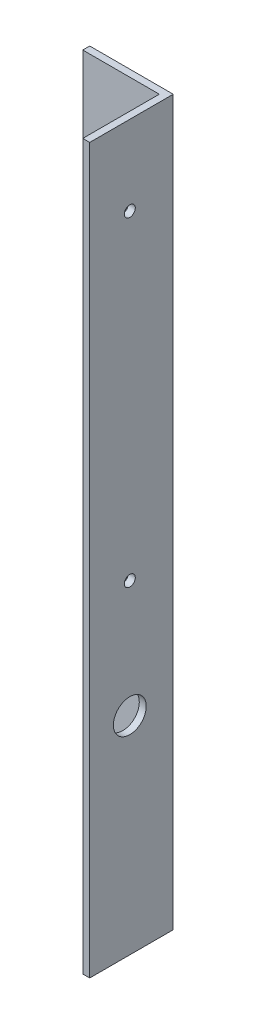
ISO-10303-21;
HEADER;
FILE_DESCRIPTION(('STEP AP214'),'2;1');
FILE_NAME('part.step','',(''),(''),'','','');
FILE_SCHEMA(('AUTOMOTIVE_DESIGN { 1 0 10303 214 1 1 1 1 }'));
ENDSEC;
DATA;
#1=APPLICATION_CONTEXT('core data for automotive mechanical design processes');
#2=APPLICATION_PROTOCOL_DEFINITION('international standard','automotive_design',2000,#1);
#3=PRODUCT_CONTEXT('',#1,'mechanical');
#4=PRODUCT('Part','Part','',(#3));
#5=PRODUCT_RELATED_PRODUCT_CATEGORY('part','',(#4));
#6=PRODUCT_DEFINITION_FORMATION('','',#4);
#7=PRODUCT_DEFINITION_CONTEXT('part definition',#1,'design');
#8=PRODUCT_DEFINITION('design','',#6,#7);
#9=PRODUCT_DEFINITION_SHAPE('','',#8);
#10=(LENGTH_UNIT() NAMED_UNIT(*) SI_UNIT(.MILLI.,.METRE.));
#11=(NAMED_UNIT(*) PLANE_ANGLE_UNIT() SI_UNIT($,.RADIAN.));
#12=(NAMED_UNIT(*) SI_UNIT($,.STERADIAN.) SOLID_ANGLE_UNIT());
#13=UNCERTAINTY_MEASURE_WITH_UNIT(LENGTH_MEASURE(1.E-05),#10,'distance_accuracy_value','');
#14=(GEOMETRIC_REPRESENTATION_CONTEXT(3) GLOBAL_UNCERTAINTY_ASSIGNED_CONTEXT((#13)) GLOBAL_UNIT_ASSIGNED_CONTEXT((#10,
#11,#12)) REPRESENTATION_CONTEXT('',''));
#15=CARTESIAN_POINT('',(0.,0.,0.));
#16=DIRECTION('',(0.,0.,1.));
#17=DIRECTION('',(1.,0.,0.));
#18=AXIS2_PLACEMENT_3D('',#15,#16,#17);
#19=CARTESIAN_POINT('',(15.875,165.1,19.05));
#20=DIRECTION('',(0.,0.,-1.));
#21=DIRECTION('',(-1.,0.,0.));
#22=AXIS2_PLACEMENT_3D('',#19,#20,#21);
#23=PLANE('',#22);
#24=DIRECTION('',(1.,0.,0.));
#25=VECTOR('',#24,1.);
#26=CARTESIAN_POINT('',(15.875,-165.1,19.05));
#27=LINE('',#26,#25);
#28=CARTESIAN_POINT('',(15.875,-165.1,19.05));
#29=VERTEX_POINT('',#28);
#30=CARTESIAN_POINT('',(19.05,-165.1,19.05));
#31=VERTEX_POINT('',#30);
#32=EDGE_CURVE('E118',#29,#31,#27,.T.);
#33=ORIENTED_EDGE('',*,*,#32,.T.);
#34=DIRECTION('',(0.,-1.,0.));
#35=VECTOR('',#34,1.);
#36=CARTESIAN_POINT('',(19.05,165.1,19.05));
#37=LINE('',#36,#35);
#38=CARTESIAN_POINT('',(19.05,165.1,19.05));
#39=VERTEX_POINT('',#38);
#40=EDGE_CURVE('E11',#39,#31,#37,.T.);
#41=ORIENTED_EDGE('',*,*,#40,.F.);
#42=DIRECTION('',(1.,0.,0.));
#43=VECTOR('',#42,1.);
#44=CARTESIAN_POINT('',(15.875,165.1,19.05));
#45=LINE('',#44,#43);
#46=CARTESIAN_POINT('',(15.875,165.1,19.05));
#47=VERTEX_POINT('',#46);
#48=EDGE_CURVE('E129',#47,#39,#45,.T.);
#49=ORIENTED_EDGE('',*,*,#48,.F.);
#50=DIRECTION('',(0.,-1.,0.));
#51=VECTOR('',#50,1.);
#52=CARTESIAN_POINT('',(15.875,165.1,19.05));
#53=LINE('',#52,#51);
#54=EDGE_CURVE('E114',#47,#29,#53,.T.);
#55=ORIENTED_EDGE('',*,*,#54,.T.);
#56=EDGE_LOOP('',(#33,#41,#49,#55));
#57=FACE_BOUND('',#56,.T.);
#58=ADVANCED_FACE('F32',(#57),#23,.F.);
#59=CARTESIAN_POINT('',(19.05,165.1,-19.05));
#60=DIRECTION('',(-1.,0.,0.));
#61=DIRECTION('',(0.,0.,1.));
#62=AXIS2_PLACEMENT_3D('',#59,#60,#61);
#63=PLANE('',#62);
#64=CARTESIAN_POINT('',(19.05,-70.5739,0.762000000000023));
#65=DIRECTION('',(-1.,0.,0.));
#66=DIRECTION('',(0.,0.,1.));
#67=AXIS2_PLACEMENT_3D('',#64,#65,#66);
#68=CIRCLE('',#67,7.50000000000001);
#69=CARTESIAN_POINT('',(19.05,-70.5739,8.26200000000003));
#70=VERTEX_POINT('',#69);
#71=EDGE_CURVE('E122',#70,#70,#68,.T.);
#72=ORIENTED_EDGE('',*,*,#71,.T.);
#73=EDGE_LOOP('',(#72));
#74=FACE_BOUND('',#73,.T.);
#75=CARTESIAN_POINT('',(19.05,128.8161,0.762000000000002));
#76=DIRECTION('',(-1.,0.,0.));
#77=DIRECTION('',(0.,0.,1.));
#78=AXIS2_PLACEMENT_3D('',#75,#76,#77);
#79=CIRCLE('',#78,2.49999999999992);
#80=CARTESIAN_POINT('',(19.05,128.8161,3.26199999999993));
#81=VERTEX_POINT('',#80);
#82=EDGE_CURVE('E140',#81,#81,#79,.T.);
#83=ORIENTED_EDGE('',*,*,#82,.T.);
#84=EDGE_LOOP('',(#83));
#85=FACE_BOUND('',#84,.T.);
#86=CARTESIAN_POINT('',(19.05,-17.2339,0.762000000000009));
#87=DIRECTION('',(-1.,0.,0.));
#88=DIRECTION('',(0.,0.,1.));
#89=AXIS2_PLACEMENT_3D('',#86,#87,#88);
#90=CIRCLE('',#89,2.49999999999995);
#91=CARTESIAN_POINT('',(19.05,-17.2339,3.26199999999996));
#92=VERTEX_POINT('',#91);
#93=EDGE_CURVE('E137',#92,#92,#90,.T.);
#94=ORIENTED_EDGE('',*,*,#93,.T.);
#95=EDGE_LOOP('',(#94));
#96=FACE_BOUND('',#95,.T.);
#97=DIRECTION('',(0.,0.,-1.));
#98=VECTOR('',#97,1.);
#99=CARTESIAN_POINT('',(19.05,-165.1,-19.05));
#100=LINE('',#99,#98);
#101=CARTESIAN_POINT('',(19.05,-165.1,-19.05));
#102=VERTEX_POINT('',#101);
#103=EDGE_CURVE('E121',#31,#102,#100,.T.);
#104=ORIENTED_EDGE('',*,*,#103,.T.);
#105=DIRECTION('',(0.,-1.,0.));
#106=VECTOR('',#105,1.);
#107=CARTESIAN_POINT('',(19.05,165.1,-19.05));
#108=LINE('',#107,#106);
#109=CARTESIAN_POINT('',(19.05,165.1,-19.05));
#110=VERTEX_POINT('',#109);
#111=EDGE_CURVE('E41',#110,#102,#108,.T.);
#112=ORIENTED_EDGE('',*,*,#111,.F.);
#113=DIRECTION('',(0.,0.,-1.));
#114=VECTOR('',#113,1.);
#115=CARTESIAN_POINT('',(19.05,165.1,-19.05));
#116=LINE('',#115,#114);
#117=EDGE_CURVE('E87',#39,#110,#116,.T.);
#118=ORIENTED_EDGE('',*,*,#117,.F.);
#119=ORIENTED_EDGE('',*,*,#40,.T.);
#120=EDGE_LOOP('',(#104,#112,#118,#119));
#121=FACE_BOUND('',#120,.T.);
#122=ADVANCED_FACE('F155',(#74,#85,#96,#121),#63,.F.);
#123=CARTESIAN_POINT('',(-19.05,165.1,-19.05));
#124=DIRECTION('',(0.,0.,1.));
#125=DIRECTION('',(1.,0.,0.));
#126=AXIS2_PLACEMENT_3D('',#123,#124,#125);
#127=PLANE('',#126);
#128=DIRECTION('',(-1.,0.,0.));
#129=VECTOR('',#128,1.);
#130=CARTESIAN_POINT('',(-19.05,-165.1,-19.05));
#131=LINE('',#130,#129);
#132=CARTESIAN_POINT('',(-19.05,-165.1,-19.05));
#133=VERTEX_POINT('',#132);
#134=EDGE_CURVE('E124',#102,#133,#131,.T.);
#135=ORIENTED_EDGE('',*,*,#134,.T.);
#136=DIRECTION('',(0.,-1.,0.));
#137=VECTOR('',#136,1.);
#138=CARTESIAN_POINT('',(-19.05,165.1,-19.05));
#139=LINE('',#138,#137);
#140=CARTESIAN_POINT('',(-19.05,165.1,-19.05));
#141=VERTEX_POINT('',#140);
#142=EDGE_CURVE('E109',#141,#133,#139,.T.);
#143=ORIENTED_EDGE('',*,*,#142,.F.);
#144=DIRECTION('',(-1.,0.,0.));
#145=VECTOR('',#144,1.);
#146=CARTESIAN_POINT('',(-19.05,165.1,-19.05));
#147=LINE('',#146,#145);
#148=EDGE_CURVE('E100',#110,#141,#147,.T.);
#149=ORIENTED_EDGE('',*,*,#148,.F.);
#150=ORIENTED_EDGE('',*,*,#111,.T.);
#151=EDGE_LOOP('',(#135,#143,#149,#150));
#152=FACE_BOUND('',#151,.T.);
#153=ADVANCED_FACE('F158',(#152),#127,.F.);
#154=CARTESIAN_POINT('',(-19.05,165.1,-15.875));
#155=DIRECTION('',(1.,0.,0.));
#156=DIRECTION('',(0.,0.,-1.));
#157=AXIS2_PLACEMENT_3D('',#154,#155,#156);
#158=PLANE('',#157);
#159=DIRECTION('',(0.,0.,1.));
#160=VECTOR('',#159,1.);
#161=CARTESIAN_POINT('',(-19.05,-165.1,-15.875));
#162=LINE('',#161,#160);
#163=CARTESIAN_POINT('',(-19.05,-165.1,-15.875));
#164=VERTEX_POINT('',#163);
#165=EDGE_CURVE('E108',#133,#164,#162,.T.);
#166=ORIENTED_EDGE('',*,*,#165,.T.);
#167=DIRECTION('',(0.,-1.,0.));
#168=VECTOR('',#167,1.);
#169=CARTESIAN_POINT('',(-19.05,165.1,-15.875));
#170=LINE('',#169,#168);
#171=CARTESIAN_POINT('',(-19.05,165.1,-15.875));
#172=VERTEX_POINT('',#171);
#173=EDGE_CURVE('E105',#172,#164,#170,.T.);
#174=ORIENTED_EDGE('',*,*,#173,.F.);
#175=DIRECTION('',(0.,0.,1.));
#176=VECTOR('',#175,1.);
#177=CARTESIAN_POINT('',(-19.05,165.1,-15.875));
#178=LINE('',#177,#176);
#179=EDGE_CURVE('E94',#141,#172,#178,.T.);
#180=ORIENTED_EDGE('',*,*,#179,.F.);
#181=ORIENTED_EDGE('',*,*,#142,.T.);
#182=EDGE_LOOP('',(#166,#174,#180,#181));
#183=FACE_BOUND('',#182,.T.);
#184=ADVANCED_FACE('F106',(#183),#158,.F.);
#185=CARTESIAN_POINT('',(15.875,165.1,-15.875));
#186=DIRECTION('',(0.,0.,-1.));
#187=DIRECTION('',(-1.,0.,0.));
#188=AXIS2_PLACEMENT_3D('',#185,#186,#187);
#189=PLANE('',#188);
#190=DIRECTION('',(1.,0.,0.));
#191=VECTOR('',#190,1.);
#192=CARTESIAN_POINT('',(15.875,-165.1,-15.875));
#193=LINE('',#192,#191);
#194=CARTESIAN_POINT('',(15.875,-165.1,-15.875));
#195=VERTEX_POINT('',#194);
#196=EDGE_CURVE('E73',#164,#195,#193,.T.);
#197=ORIENTED_EDGE('',*,*,#196,.T.);
#198=DIRECTION('',(0.,-1.,0.));
#199=VECTOR('',#198,1.);
#200=CARTESIAN_POINT('',(15.875,165.1,-15.875));
#201=LINE('',#200,#199);
#202=CARTESIAN_POINT('',(15.875,165.1,-15.875));
#203=VERTEX_POINT('',#202);
#204=EDGE_CURVE('E110',#203,#195,#201,.T.);
#205=ORIENTED_EDGE('',*,*,#204,.F.);
#206=DIRECTION('',(1.,0.,0.));
#207=VECTOR('',#206,1.);
#208=CARTESIAN_POINT('',(15.875,165.1,-15.875));
#209=LINE('',#208,#207);
#210=EDGE_CURVE('E98',#172,#203,#209,.T.);
#211=ORIENTED_EDGE('',*,*,#210,.F.);
#212=ORIENTED_EDGE('',*,*,#173,.T.);
#213=EDGE_LOOP('',(#197,#205,#211,#212));
#214=FACE_BOUND('',#213,.T.);
#215=ADVANCED_FACE('F112',(#214),#189,.F.);
#216=CARTESIAN_POINT('',(15.875,165.1,19.05));
#217=DIRECTION('',(1.,0.,0.));
#218=DIRECTION('',(0.,0.,-1.));
#219=AXIS2_PLACEMENT_3D('',#216,#217,#218);
#220=PLANE('',#219);
#221=CARTESIAN_POINT('',(15.875,-70.5739,0.762000000000024));
#222=DIRECTION('',(1.,0.,0.));
#223=DIRECTION('',(0.,0.,-1.));
#224=AXIS2_PLACEMENT_3D('',#221,#222,#223);
#225=CIRCLE('',#224,7.50000000000001);
#226=CARTESIAN_POINT('',(15.875,-70.5739,-6.73799999999998));
#227=VERTEX_POINT('',#226);
#228=EDGE_CURVE('E35',#227,#227,#225,.T.);
#229=ORIENTED_EDGE('',*,*,#228,.T.);
#230=EDGE_LOOP('',(#229));
#231=FACE_BOUND('',#230,.T.);
#232=CARTESIAN_POINT('',(15.875,128.8161,0.762000000000003));
#233=DIRECTION('',(1.,0.,0.));
#234=DIRECTION('',(0.,0.,-1.));
#235=AXIS2_PLACEMENT_3D('',#232,#233,#234);
#236=CIRCLE('',#235,2.49999999999992);
#237=CARTESIAN_POINT('',(15.875,128.8161,-1.73799999999992));
#238=VERTEX_POINT('',#237);
#239=EDGE_CURVE('E138',#238,#238,#236,.T.);
#240=ORIENTED_EDGE('',*,*,#239,.T.);
#241=EDGE_LOOP('',(#240));
#242=FACE_BOUND('',#241,.T.);
#243=CARTESIAN_POINT('',(15.875,-17.2339,0.76200000000001));
#244=DIRECTION('',(1.,0.,0.));
#245=DIRECTION('',(0.,0.,-1.));
#246=AXIS2_PLACEMENT_3D('',#243,#244,#245);
#247=CIRCLE('',#246,2.49999999999995);
#248=CARTESIAN_POINT('',(15.875,-17.2339,-1.73799999999994));
#249=VERTEX_POINT('',#248);
#250=EDGE_CURVE('E135',#249,#249,#247,.T.);
#251=ORIENTED_EDGE('',*,*,#250,.T.);
#252=EDGE_LOOP('',(#251));
#253=FACE_BOUND('',#252,.T.);
#254=DIRECTION('',(0.,0.,1.));
#255=VECTOR('',#254,1.);
#256=CARTESIAN_POINT('',(15.875,-165.1,19.05));
#257=LINE('',#256,#255);
#258=EDGE_CURVE('E79',#195,#29,#257,.T.);
#259=ORIENTED_EDGE('',*,*,#258,.T.);
#260=ORIENTED_EDGE('',*,*,#54,.F.);
#261=DIRECTION('',(0.,0.,1.));
#262=VECTOR('',#261,1.);
#263=CARTESIAN_POINT('',(15.875,165.1,19.05));
#264=LINE('',#263,#262);
#265=EDGE_CURVE('E50',#203,#47,#264,.T.);
#266=ORIENTED_EDGE('',*,*,#265,.F.);
#267=ORIENTED_EDGE('',*,*,#204,.T.);
#268=EDGE_LOOP('',(#259,#260,#266,#267));
#269=FACE_BOUND('',#268,.T.);
#270=ADVANCED_FACE('F163',(#231,#242,#253,#269),#220,.F.);
#271=CARTESIAN_POINT('',(0.,165.1,0.));
#272=DIRECTION('',(0.,-1.,0.));
#273=DIRECTION('',(0.,0.,-1.));
#274=AXIS2_PLACEMENT_3D('',#271,#272,#273);
#275=PLANE('',#274);
#276=ORIENTED_EDGE('',*,*,#48,.T.);
#277=ORIENTED_EDGE('',*,*,#117,.T.);
#278=ORIENTED_EDGE('',*,*,#148,.T.);
#279=ORIENTED_EDGE('',*,*,#179,.T.);
#280=ORIENTED_EDGE('',*,*,#210,.T.);
#281=ORIENTED_EDGE('',*,*,#265,.T.);
#282=EDGE_LOOP('',(#276,#277,#278,#279,#280,#281));
#283=FACE_BOUND('',#282,.T.);
#284=ADVANCED_FACE('F96',(#283),#275,.F.);
#285=CARTESIAN_POINT('',(0.,-165.1,0.));
#286=DIRECTION('',(0.,-1.,0.));
#287=DIRECTION('',(0.,0.,-1.));
#288=AXIS2_PLACEMENT_3D('',#285,#286,#287);
#289=PLANE('',#288);
#290=ORIENTED_EDGE('',*,*,#32,.F.);
#291=ORIENTED_EDGE('',*,*,#258,.F.);
#292=ORIENTED_EDGE('',*,*,#196,.F.);
#293=ORIENTED_EDGE('',*,*,#165,.F.);
#294=ORIENTED_EDGE('',*,*,#134,.F.);
#295=ORIENTED_EDGE('',*,*,#103,.F.);
#296=EDGE_LOOP('',(#290,#291,#292,#293,#294,#295));
#297=FACE_BOUND('',#296,.T.);
#298=ADVANCED_FACE('F161',(#297),#289,.T.);
#299=CARTESIAN_POINT('',(-19.05,-17.2339,0.762000000000016));
#300=DIRECTION('',(1.,0.,0.));
#301=DIRECTION('',(0.,0.,-1.));
#302=AXIS2_PLACEMENT_3D('',#299,#300,#301);
#303=CYLINDRICAL_SURFACE('',#302,2.49999999999995);
#304=ORIENTED_EDGE('',*,*,#250,.F.);
#305=EDGE_LOOP('',(#304));
#306=FACE_BOUND('',#305,.T.);
#307=ORIENTED_EDGE('',*,*,#93,.F.);
#308=EDGE_LOOP('',(#307));
#309=FACE_BOUND('',#308,.T.);
#310=ADVANCED_FACE('F210',(#306,#309),#303,.F.);
#311=CARTESIAN_POINT('',(-19.05,128.8161,0.762000000000009));
#312=DIRECTION('',(1.,0.,0.));
#313=DIRECTION('',(0.,0.,-1.));
#314=AXIS2_PLACEMENT_3D('',#311,#312,#313);
#315=CYLINDRICAL_SURFACE('',#314,2.49999999999992);
#316=ORIENTED_EDGE('',*,*,#239,.F.);
#317=EDGE_LOOP('',(#316));
#318=FACE_BOUND('',#317,.T.);
#319=ORIENTED_EDGE('',*,*,#82,.F.);
#320=EDGE_LOOP('',(#319));
#321=FACE_BOUND('',#320,.T.);
#322=ADVANCED_FACE('F228',(#318,#321),#315,.F.);
#323=CARTESIAN_POINT('',(-19.05,-70.5739,0.76200000000003));
#324=DIRECTION('',(1.,0.,0.));
#325=DIRECTION('',(0.,0.,-1.));
#326=AXIS2_PLACEMENT_3D('',#323,#324,#325);
#327=CYLINDRICAL_SURFACE('',#326,7.50000000000001);
#328=ORIENTED_EDGE('',*,*,#228,.F.);
#329=EDGE_LOOP('',(#328));
#330=FACE_BOUND('',#329,.T.);
#331=ORIENTED_EDGE('',*,*,#71,.F.);
#332=EDGE_LOOP('',(#331));
#333=FACE_BOUND('',#332,.T.);
#334=ADVANCED_FACE('F238',(#330,#333),#327,.F.);
#335=CLOSED_SHELL('',(#58,#122,#153,#184,#215,#270,#284,#298,#310,#322,#334));
#336=MANIFOLD_SOLID_BREP('B2',#335);
#337=ADVANCED_BREP_SHAPE_REPRESENTATION('',(#18,#336),#14);
#338=SHAPE_DEFINITION_REPRESENTATION(#9,#337);
ENDSEC;
END-ISO-10303-21;
